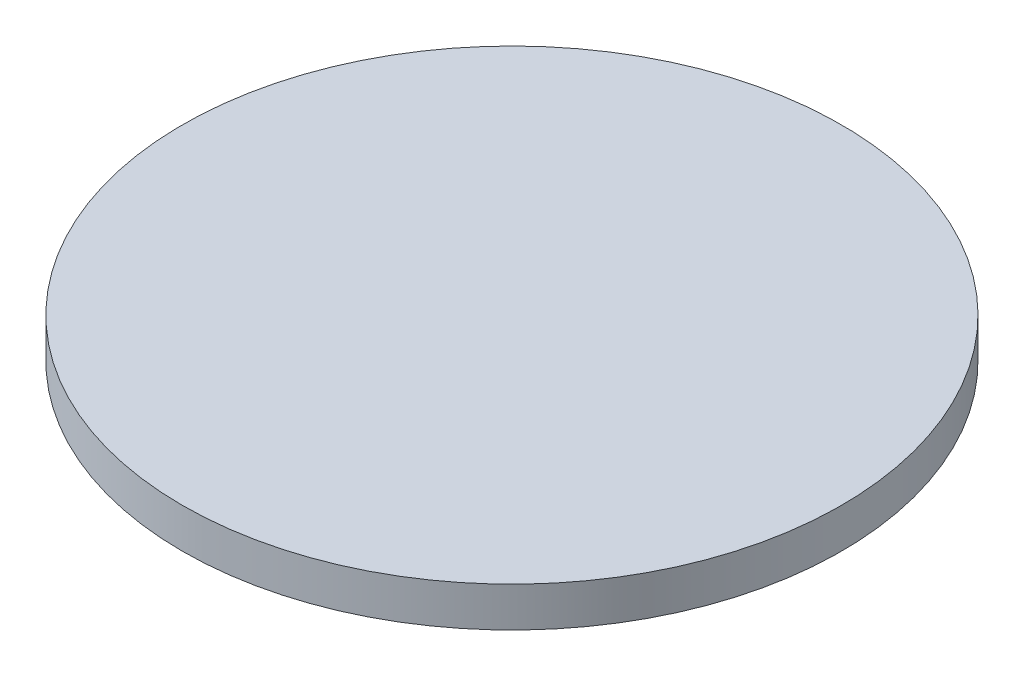
ISO-10303-21;
HEADER;
FILE_DESCRIPTION(('STEP AP214'),'2;1');
FILE_NAME('part.step','',(''),(''),'','','');
FILE_SCHEMA(('AUTOMOTIVE_DESIGN { 1 0 10303 214 1 1 1 1 }'));
ENDSEC;
DATA;
#1=APPLICATION_CONTEXT('core data for automotive mechanical design processes');
#2=APPLICATION_PROTOCOL_DEFINITION('international standard','automotive_design',2000,#1);
#3=PRODUCT_CONTEXT('',#1,'mechanical');
#4=PRODUCT('Part','Part','',(#3));
#5=PRODUCT_RELATED_PRODUCT_CATEGORY('part','',(#4));
#6=PRODUCT_DEFINITION_FORMATION('','',#4);
#7=PRODUCT_DEFINITION_CONTEXT('part definition',#1,'design');
#8=PRODUCT_DEFINITION('design','',#6,#7);
#9=PRODUCT_DEFINITION_SHAPE('','',#8);
#10=(LENGTH_UNIT() NAMED_UNIT(*) SI_UNIT(.MILLI.,.METRE.));
#11=(NAMED_UNIT(*) PLANE_ANGLE_UNIT() SI_UNIT($,.RADIAN.));
#12=(NAMED_UNIT(*) SI_UNIT($,.STERADIAN.) SOLID_ANGLE_UNIT());
#13=UNCERTAINTY_MEASURE_WITH_UNIT(LENGTH_MEASURE(1.E-05),#10,'distance_accuracy_value','');
#14=(GEOMETRIC_REPRESENTATION_CONTEXT(3) GLOBAL_UNCERTAINTY_ASSIGNED_CONTEXT((#13)) GLOBAL_UNIT_ASSIGNED_CONTEXT((#10,
#11,#12)) REPRESENTATION_CONTEXT('',''));
#15=CARTESIAN_POINT('',(0.,0.,0.));
#16=DIRECTION('',(0.,0.,1.));
#17=DIRECTION('',(1.,0.,0.));
#18=AXIS2_PLACEMENT_3D('',#15,#16,#17);
#19=CARTESIAN_POINT('',(-12.5,0.,0.));
#20=DIRECTION('',(0.,1.,0.));
#21=DIRECTION('',(0.,0.,1.));
#22=AXIS2_PLACEMENT_3D('',#19,#20,#21);
#23=PLANE('',#22);
#24=CARTESIAN_POINT('',(0.,0.,0.));
#25=DIRECTION('',(0.,1.,0.));
#26=DIRECTION('',(0.,0.,1.));
#27=AXIS2_PLACEMENT_3D('',#24,#25,#26);
#28=CIRCLE('',#27,25.);
#29=CARTESIAN_POINT('',(0.,0.,25.));
#30=VERTEX_POINT('',#29);
#31=EDGE_CURVE('E17',#30,#30,#28,.F.);
#32=ORIENTED_EDGE('',*,*,#31,.F.);
#33=EDGE_LOOP('',(#32));
#34=FACE_BOUND('',#33,.T.);
#35=ADVANCED_FACE('F14',(#34),#23,.T.);
#36=CARTESIAN_POINT('',(0.,-1.50711279284914,0.));
#37=DIRECTION('',(0.,1.,0.));
#38=DIRECTION('',(0.,0.,1.));
#39=AXIS2_PLACEMENT_3D('',#36,#37,#38);
#40=CYLINDRICAL_SURFACE('',#39,25.);
#41=CARTESIAN_POINT('',(0.,-3.01422558569828,0.));
#42=DIRECTION('',(0.,1.,0.));
#43=DIRECTION('',(0.,0.,1.));
#44=AXIS2_PLACEMENT_3D('',#41,#42,#43);
#45=CIRCLE('',#44,25.);
#46=CARTESIAN_POINT('',(0.,-3.01422558569828,25.));
#47=VERTEX_POINT('',#46);
#48=EDGE_CURVE('E10',#47,#47,#45,.F.);
#49=ORIENTED_EDGE('',*,*,#48,.F.);
#50=EDGE_LOOP('',(#49));
#51=FACE_BOUND('',#50,.T.);
#52=ORIENTED_EDGE('',*,*,#31,.T.);
#53=EDGE_LOOP('',(#52));
#54=FACE_BOUND('',#53,.T.);
#55=ADVANCED_FACE('F32',(#51,#54),#40,.T.);
#56=CARTESIAN_POINT('',(0.,46.2,0.));
#57=DIRECTION('',(1.,0.,0.));
#58=DIRECTION('',(0.,1.,0.));
#59=AXIS2_PLACEMENT_3D('',#56,#57,#58);
#60=SPHERICAL_SURFACE('',#59,55.2);
#61=ORIENTED_EDGE('',*,*,#48,.T.);
#62=EDGE_LOOP('',(#61));
#63=FACE_BOUND('',#62,.T.);
#64=ADVANCED_FACE('F30',(#63),#60,.T.);
#65=CLOSED_SHELL('',(#35,#55,#64));
#66=MANIFOLD_SOLID_BREP('B1',#65);
#67=ADVANCED_BREP_SHAPE_REPRESENTATION('',(#18,#66),#14);
#68=SHAPE_DEFINITION_REPRESENTATION(#9,#67);
ENDSEC;
END-ISO-10303-21;
